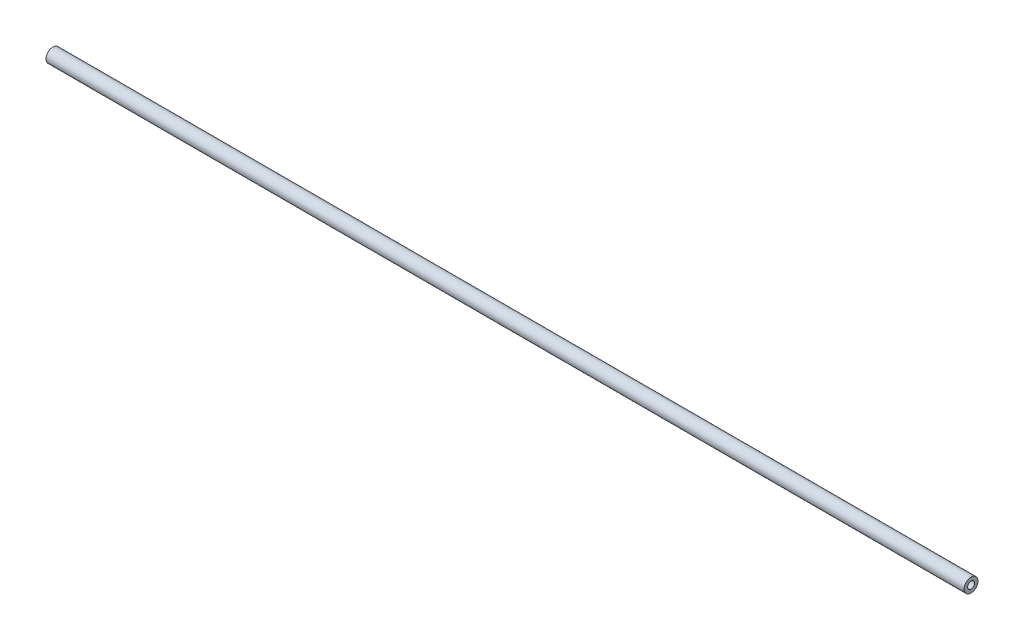
ISO-10303-21;
HEADER;
FILE_DESCRIPTION(('STEP AP214'),'2;1');
FILE_NAME('part.step','',(''),(''),'','','');
FILE_SCHEMA(('AUTOMOTIVE_DESIGN { 1 0 10303 214 1 1 1 1 }'));
ENDSEC;
DATA;
#1=APPLICATION_CONTEXT('core data for automotive mechanical design processes');
#2=APPLICATION_PROTOCOL_DEFINITION('international standard','automotive_design',2000,#1);
#3=PRODUCT_CONTEXT('',#1,'mechanical');
#4=PRODUCT('Part','Part','',(#3));
#5=PRODUCT_RELATED_PRODUCT_CATEGORY('part','',(#4));
#6=PRODUCT_DEFINITION_FORMATION('','',#4);
#7=PRODUCT_DEFINITION_CONTEXT('part definition',#1,'design');
#8=PRODUCT_DEFINITION('design','',#6,#7);
#9=PRODUCT_DEFINITION_SHAPE('','',#8);
#10=(LENGTH_UNIT() NAMED_UNIT(*) SI_UNIT(.MILLI.,.METRE.));
#11=(NAMED_UNIT(*) PLANE_ANGLE_UNIT() SI_UNIT($,.RADIAN.));
#12=(NAMED_UNIT(*) SI_UNIT($,.STERADIAN.) SOLID_ANGLE_UNIT());
#13=UNCERTAINTY_MEASURE_WITH_UNIT(LENGTH_MEASURE(1.E-05),#10,'distance_accuracy_value','');
#14=(GEOMETRIC_REPRESENTATION_CONTEXT(3) GLOBAL_UNCERTAINTY_ASSIGNED_CONTEXT((#13)) GLOBAL_UNIT_ASSIGNED_CONTEXT((#10,
#11,#12)) REPRESENTATION_CONTEXT('',''));
#15=CARTESIAN_POINT('',(0.,0.,0.));
#16=DIRECTION('',(0.,0.,1.));
#17=DIRECTION('',(1.,0.,0.));
#18=AXIS2_PLACEMENT_3D('',#15,#16,#17);
#19=CARTESIAN_POINT('',(841.1765625,0.,0.));
#20=DIRECTION('',(1.,0.,0.));
#21=DIRECTION('',(0.,0.,-1.));
#22=AXIS2_PLACEMENT_3D('',#19,#20,#21);
#23=PLANE('',#22);
#24=CARTESIAN_POINT('',(841.1765625,0.,0.));
#25=DIRECTION('',(1.,0.,0.));
#26=DIRECTION('',(0.,0.,-1.));
#27=AXIS2_PLACEMENT_3D('',#24,#25,#26);
#28=CIRCLE('',#27,6.35);
#29=CARTESIAN_POINT('',(841.1765625,0.,-6.35));
#30=VERTEX_POINT('',#29);
#31=EDGE_CURVE('E11',#30,#30,#28,.T.);
#32=ORIENTED_EDGE('',*,*,#31,.T.);
#33=EDGE_LOOP('',(#32));
#34=FACE_BOUND('',#33,.T.);
#35=CARTESIAN_POINT('',(841.1765625,0.,0.));
#36=DIRECTION('',(1.,0.,0.));
#37=DIRECTION('',(0.,0.,-1.));
#38=AXIS2_PLACEMENT_3D('',#35,#36,#37);
#39=CIRCLE('',#38,3.175);
#40=CARTESIAN_POINT('',(841.1765625,0.,-3.175));
#41=VERTEX_POINT('',#40);
#42=EDGE_CURVE('E60',#41,#41,#39,.T.);
#43=ORIENTED_EDGE('',*,*,#42,.F.);
#44=EDGE_LOOP('',(#43));
#45=FACE_BOUND('',#44,.T.);
#46=ADVANCED_FACE('F46',(#34,#45),#23,.T.);
#47=CARTESIAN_POINT('',(0.,0.,0.));
#48=DIRECTION('',(1.,0.,0.));
#49=DIRECTION('',(0.,0.,-1.));
#50=AXIS2_PLACEMENT_3D('',#47,#48,#49);
#51=PLANE('',#50);
#52=CARTESIAN_POINT('',(0.,0.,0.));
#53=DIRECTION('',(1.,0.,0.));
#54=DIRECTION('',(0.,0.,-1.));
#55=AXIS2_PLACEMENT_3D('',#52,#53,#54);
#56=CIRCLE('',#55,6.35);
#57=CARTESIAN_POINT('',(0.,0.,-6.35));
#58=VERTEX_POINT('',#57);
#59=EDGE_CURVE('E50',#58,#58,#56,.T.);
#60=ORIENTED_EDGE('',*,*,#59,.F.);
#61=EDGE_LOOP('',(#60));
#62=FACE_BOUND('',#61,.T.);
#63=CARTESIAN_POINT('',(0.,0.,0.));
#64=DIRECTION('',(1.,0.,0.));
#65=DIRECTION('',(0.,0.,-1.));
#66=AXIS2_PLACEMENT_3D('',#63,#64,#65);
#67=CIRCLE('',#66,3.175);
#68=CARTESIAN_POINT('',(0.,0.,-3.175));
#69=VERTEX_POINT('',#68);
#70=EDGE_CURVE('E63',#69,#69,#67,.T.);
#71=ORIENTED_EDGE('',*,*,#70,.T.);
#72=EDGE_LOOP('',(#71));
#73=FACE_BOUND('',#72,.T.);
#74=ADVANCED_FACE('F78',(#62,#73),#51,.F.);
#75=CARTESIAN_POINT('',(841.1765625,0.,0.));
#76=DIRECTION('',(-1.,0.,0.));
#77=DIRECTION('',(0.,0.,1.));
#78=AXIS2_PLACEMENT_3D('',#75,#76,#77);
#79=CYLINDRICAL_SURFACE('',#78,6.35);
#80=ORIENTED_EDGE('',*,*,#31,.F.);
#81=EDGE_LOOP('',(#80));
#82=FACE_BOUND('',#81,.T.);
#83=ORIENTED_EDGE('',*,*,#59,.T.);
#84=EDGE_LOOP('',(#83));
#85=FACE_BOUND('',#84,.T.);
#86=ADVANCED_FACE('F48',(#82,#85),#79,.T.);
#87=CARTESIAN_POINT('',(841.1765625,0.,0.));
#88=DIRECTION('',(-1.,0.,0.));
#89=DIRECTION('',(0.,0.,1.));
#90=AXIS2_PLACEMENT_3D('',#87,#88,#89);
#91=CYLINDRICAL_SURFACE('',#90,3.175);
#92=ORIENTED_EDGE('',*,*,#42,.T.);
#93=EDGE_LOOP('',(#92));
#94=FACE_BOUND('',#93,.T.);
#95=ORIENTED_EDGE('',*,*,#70,.F.);
#96=EDGE_LOOP('',(#95));
#97=FACE_BOUND('',#96,.T.);
#98=ADVANCED_FACE('F74',(#94,#97),#91,.F.);
#99=CLOSED_SHELL('',(#46,#74,#86,#98));
#100=MANIFOLD_SOLID_BREP('B2',#99);
#101=ADVANCED_BREP_SHAPE_REPRESENTATION('',(#18,#100),#14);
#102=SHAPE_DEFINITION_REPRESENTATION(#9,#101);
ENDSEC;
END-ISO-10303-21;
